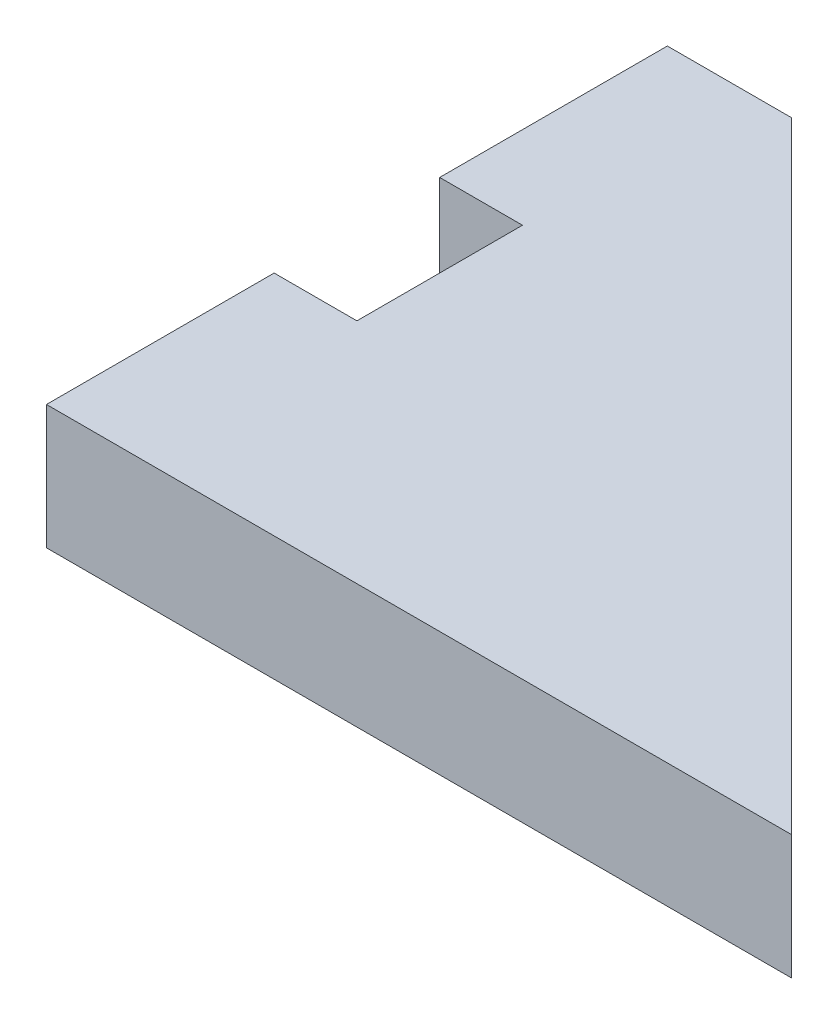
ISO-10303-21;
HEADER;
FILE_DESCRIPTION(('STEP AP214'),'2;1');
FILE_NAME('part.step','',(''),(''),'','','');
FILE_SCHEMA(('AUTOMOTIVE_DESIGN { 1 0 10303 214 1 1 1 1 }'));
ENDSEC;
DATA;
#1=APPLICATION_CONTEXT('core data for automotive mechanical design processes');
#2=APPLICATION_PROTOCOL_DEFINITION('international standard','automotive_design',2000,#1);
#3=PRODUCT_CONTEXT('',#1,'mechanical');
#4=PRODUCT('Part','Part','',(#3));
#5=PRODUCT_RELATED_PRODUCT_CATEGORY('part','',(#4));
#6=PRODUCT_DEFINITION_FORMATION('','',#4);
#7=PRODUCT_DEFINITION_CONTEXT('part definition',#1,'design');
#8=PRODUCT_DEFINITION('design','',#6,#7);
#9=PRODUCT_DEFINITION_SHAPE('','',#8);
#10=(LENGTH_UNIT() NAMED_UNIT(*) SI_UNIT(.MILLI.,.METRE.));
#11=(NAMED_UNIT(*) PLANE_ANGLE_UNIT() SI_UNIT($,.RADIAN.));
#12=(NAMED_UNIT(*) SI_UNIT($,.STERADIAN.) SOLID_ANGLE_UNIT());
#13=UNCERTAINTY_MEASURE_WITH_UNIT(LENGTH_MEASURE(1.E-05),#10,'distance_accuracy_value','');
#14=(GEOMETRIC_REPRESENTATION_CONTEXT(3) GLOBAL_UNCERTAINTY_ASSIGNED_CONTEXT((#13)) GLOBAL_UNIT_ASSIGNED_CONTEXT((#10,
#11,#12)) REPRESENTATION_CONTEXT('',''));
#15=CARTESIAN_POINT('',(0.,0.,0.));
#16=DIRECTION('',(0.,0.,1.));
#17=DIRECTION('',(1.,0.,0.));
#18=AXIS2_PLACEMENT_3D('',#15,#16,#17);
#19=CARTESIAN_POINT('',(-1.8,0.3,0.));
#20=DIRECTION('',(0.,0.,-1.));
#21=DIRECTION('',(-1.,0.,0.));
#22=AXIS2_PLACEMENT_3D('',#19,#20,#21);
#23=PLANE('',#22);
#24=DIRECTION('',(1.,0.,0.));
#25=VECTOR('',#24,1.);
#26=CARTESIAN_POINT('',(-1.8,0.,0.));
#27=LINE('',#26,#25);
#28=CARTESIAN_POINT('',(-1.8,0.,0.));
#29=VERTEX_POINT('',#28);
#30=CARTESIAN_POINT('',(0.,0.,0.));
#31=VERTEX_POINT('',#30);
#32=EDGE_CURVE('E129',#29,#31,#27,.T.);
#33=ORIENTED_EDGE('',*,*,#32,.T.);
#34=DIRECTION('',(0.,-1.,0.));
#35=VECTOR('',#34,1.);
#36=CARTESIAN_POINT('',(0.,0.3,0.));
#37=LINE('',#36,#35);
#38=CARTESIAN_POINT('',(0.,0.3,0.));
#39=VERTEX_POINT('',#38);
#40=EDGE_CURVE('E11',#39,#31,#37,.T.);
#41=ORIENTED_EDGE('',*,*,#40,.F.);
#42=DIRECTION('',(1.,0.,0.));
#43=VECTOR('',#42,1.);
#44=CARTESIAN_POINT('',(-1.8,0.3,0.));
#45=LINE('',#44,#43);
#46=CARTESIAN_POINT('',(-1.8,0.3,0.));
#47=VERTEX_POINT('',#46);
#48=EDGE_CURVE('E143',#47,#39,#45,.T.);
#49=ORIENTED_EDGE('',*,*,#48,.F.);
#50=DIRECTION('',(0.,-1.,0.));
#51=VECTOR('',#50,1.);
#52=CARTESIAN_POINT('',(-1.8,0.3,0.));
#53=LINE('',#52,#51);
#54=EDGE_CURVE('E125',#47,#29,#53,.T.);
#55=ORIENTED_EDGE('',*,*,#54,.T.);
#56=EDGE_LOOP('',(#33,#41,#49,#55));
#57=FACE_BOUND('',#56,.T.);
#58=ADVANCED_FACE('F33',(#57),#23,.F.);
#59=CARTESIAN_POINT('',(0.,0.3,0.));
#60=DIRECTION('',(-0.707106781186544,0.,0.707106781186551));
#61=DIRECTION('',(0.707106781186551,0.,0.707106781186544));
#62=AXIS2_PLACEMENT_3D('',#59,#60,#61);
#63=PLANE('',#62);
#64=DIRECTION('',(-0.707106781186551,0.,-0.707106781186544));
#65=VECTOR('',#64,1.);
#66=CARTESIAN_POINT('',(0.,0.,0.));
#67=LINE('',#66,#65);
#68=CARTESIAN_POINT('',(-1.5,0.,-1.49999999999998));
#69=VERTEX_POINT('',#68);
#70=EDGE_CURVE('E132',#31,#69,#67,.T.);
#71=ORIENTED_EDGE('',*,*,#70,.T.);
#72=DIRECTION('',(0.,-1.,0.));
#73=VECTOR('',#72,1.);
#74=CARTESIAN_POINT('',(-1.5,0.3,-1.49999999999998));
#75=LINE('',#74,#73);
#76=CARTESIAN_POINT('',(-1.5,0.3,-1.49999999999998));
#77=VERTEX_POINT('',#76);
#78=EDGE_CURVE('E41',#77,#69,#75,.T.);
#79=ORIENTED_EDGE('',*,*,#78,.F.);
#80=DIRECTION('',(-0.707106781186551,0.,-0.707106781186544));
#81=VECTOR('',#80,1.);
#82=CARTESIAN_POINT('',(0.,0.3,0.));
#83=LINE('',#82,#81);
#84=EDGE_CURVE('E92',#39,#77,#83,.T.);
#85=ORIENTED_EDGE('',*,*,#84,.F.);
#86=ORIENTED_EDGE('',*,*,#40,.T.);
#87=EDGE_LOOP('',(#71,#79,#85,#86));
#88=FACE_BOUND('',#87,.T.);
#89=ADVANCED_FACE('F178',(#88),#63,.F.);
#90=CARTESIAN_POINT('',(-1.5,0.3,-1.49999999999998));
#91=DIRECTION('',(0.,0.,1.));
#92=DIRECTION('',(1.,0.,0.));
#93=AXIS2_PLACEMENT_3D('',#90,#91,#92);
#94=PLANE('',#93);
#95=DIRECTION('',(-1.,0.,0.));
#96=VECTOR('',#95,1.);
#97=CARTESIAN_POINT('',(-1.5,0.,-1.49999999999998));
#98=LINE('',#97,#96);
#99=CARTESIAN_POINT('',(-1.8,0.,-1.49999999999998));
#100=VERTEX_POINT('',#99);
#101=EDGE_CURVE('E134',#69,#100,#98,.T.);
#102=ORIENTED_EDGE('',*,*,#101,.T.);
#103=DIRECTION('',(0.,-1.,0.));
#104=VECTOR('',#103,1.);
#105=CARTESIAN_POINT('',(-1.8,0.3,-1.49999999999998));
#106=LINE('',#105,#104);
#107=CARTESIAN_POINT('',(-1.8,0.3,-1.49999999999998));
#108=VERTEX_POINT('',#107);
#109=EDGE_CURVE('E150',#108,#100,#106,.T.);
#110=ORIENTED_EDGE('',*,*,#109,.F.);
#111=DIRECTION('',(-1.,0.,0.));
#112=VECTOR('',#111,1.);
#113=CARTESIAN_POINT('',(-1.5,0.3,-1.49999999999998));
#114=LINE('',#113,#112);
#115=EDGE_CURVE('E158',#77,#108,#114,.T.);
#116=ORIENTED_EDGE('',*,*,#115,.F.);
#117=ORIENTED_EDGE('',*,*,#78,.T.);
#118=EDGE_LOOP('',(#102,#110,#116,#117));
#119=FACE_BOUND('',#118,.T.);
#120=ADVANCED_FACE('F156',(#119),#94,.F.);
#121=CARTESIAN_POINT('',(-1.8,0.3,-1.49999999999998));
#122=DIRECTION('',(1.,0.,0.));
#123=DIRECTION('',(0.,0.,-1.));
#124=AXIS2_PLACEMENT_3D('',#121,#122,#123);
#125=PLANE('',#124);
#126=DIRECTION('',(0.,0.,1.));
#127=VECTOR('',#126,1.);
#128=CARTESIAN_POINT('',(-1.8,0.,-1.49999999999998));
#129=LINE('',#128,#127);
#130=CARTESIAN_POINT('',(-1.8,0.,-0.949999999999992));
#131=VERTEX_POINT('',#130);
#132=EDGE_CURVE('E136',#100,#131,#129,.T.);
#133=ORIENTED_EDGE('',*,*,#132,.T.);
#134=DIRECTION('',(0.,-1.,0.));
#135=VECTOR('',#134,1.);
#136=CARTESIAN_POINT('',(-1.8,0.3,-0.949999999999992));
#137=LINE('',#136,#135);
#138=CARTESIAN_POINT('',(-1.8,0.3,-0.949999999999992));
#139=VERTEX_POINT('',#138);
#140=EDGE_CURVE('E147',#139,#131,#137,.T.);
#141=ORIENTED_EDGE('',*,*,#140,.F.);
#142=DIRECTION('',(0.,0.,1.));
#143=VECTOR('',#142,1.);
#144=CARTESIAN_POINT('',(-1.8,0.3,-1.49999999999998));
#145=LINE('',#144,#143);
#146=EDGE_CURVE('E170',#108,#139,#145,.T.);
#147=ORIENTED_EDGE('',*,*,#146,.F.);
#148=ORIENTED_EDGE('',*,*,#109,.T.);
#149=EDGE_LOOP('',(#133,#141,#147,#148));
#150=FACE_BOUND('',#149,.T.);
#151=ADVANCED_FACE('F166',(#150),#125,.F.);
#152=CARTESIAN_POINT('',(-1.8,0.3,-0.949999999999992));
#153=DIRECTION('',(0.,0.,-1.));
#154=DIRECTION('',(-1.,0.,0.));
#155=AXIS2_PLACEMENT_3D('',#152,#153,#154);
#156=PLANE('',#155);
#157=DIRECTION('',(1.,0.,0.));
#158=VECTOR('',#157,1.);
#159=CARTESIAN_POINT('',(-1.8,0.,-0.949999999999992));
#160=LINE('',#159,#158);
#161=CARTESIAN_POINT('',(-1.6,0.,-0.949999999999992));
#162=VERTEX_POINT('',#161);
#163=EDGE_CURVE('E138',#131,#162,#160,.T.);
#164=ORIENTED_EDGE('',*,*,#163,.T.);
#165=DIRECTION('',(0.,-1.,0.));
#166=VECTOR('',#165,1.);
#167=CARTESIAN_POINT('',(-1.6,0.3,-0.949999999999992));
#168=LINE('',#167,#166);
#169=CARTESIAN_POINT('',(-1.6,0.3,-0.949999999999992));
#170=VERTEX_POINT('',#169);
#171=EDGE_CURVE('E120',#170,#162,#168,.T.);
#172=ORIENTED_EDGE('',*,*,#171,.F.);
#173=DIRECTION('',(1.,0.,0.));
#174=VECTOR('',#173,1.);
#175=CARTESIAN_POINT('',(-1.8,0.3,-0.949999999999992));
#176=LINE('',#175,#174);
#177=EDGE_CURVE('E111',#139,#170,#176,.T.);
#178=ORIENTED_EDGE('',*,*,#177,.F.);
#179=ORIENTED_EDGE('',*,*,#140,.T.);
#180=EDGE_LOOP('',(#164,#172,#178,#179));
#181=FACE_BOUND('',#180,.T.);
#182=ADVANCED_FACE('F169',(#181),#156,.F.);
#183=CARTESIAN_POINT('',(-1.6,0.3,-0.949999999999992));
#184=DIRECTION('',(1.,0.,0.));
#185=DIRECTION('',(0.,0.,-1.));
#186=AXIS2_PLACEMENT_3D('',#183,#184,#185);
#187=PLANE('',#186);
#188=DIRECTION('',(0.,0.,1.));
#189=VECTOR('',#188,1.);
#190=CARTESIAN_POINT('',(-1.6,0.,-0.949999999999992));
#191=LINE('',#190,#189);
#192=CARTESIAN_POINT('',(-1.6,0.,-0.549999999999992));
#193=VERTEX_POINT('',#192);
#194=EDGE_CURVE('E119',#162,#193,#191,.T.);
#195=ORIENTED_EDGE('',*,*,#194,.T.);
#196=DIRECTION('',(0.,-1.,0.));
#197=VECTOR('',#196,1.);
#198=CARTESIAN_POINT('',(-1.6,0.3,-0.549999999999992));
#199=LINE('',#198,#197);
#200=CARTESIAN_POINT('',(-1.6,0.3,-0.549999999999992));
#201=VERTEX_POINT('',#200);
#202=EDGE_CURVE('E116',#201,#193,#199,.T.);
#203=ORIENTED_EDGE('',*,*,#202,.F.);
#204=DIRECTION('',(0.,0.,1.));
#205=VECTOR('',#204,1.);
#206=CARTESIAN_POINT('',(-1.6,0.3,-0.949999999999992));
#207=LINE('',#206,#205);
#208=EDGE_CURVE('E105',#170,#201,#207,.T.);
#209=ORIENTED_EDGE('',*,*,#208,.F.);
#210=ORIENTED_EDGE('',*,*,#171,.T.);
#211=EDGE_LOOP('',(#195,#203,#209,#210));
#212=FACE_BOUND('',#211,.T.);
#213=ADVANCED_FACE('F117',(#212),#187,.F.);
#214=CARTESIAN_POINT('',(-1.6,0.3,-0.549999999999992));
#215=DIRECTION('',(0.,0.,1.));
#216=DIRECTION('',(1.,0.,0.));
#217=AXIS2_PLACEMENT_3D('',#214,#215,#216);
#218=PLANE('',#217);
#219=DIRECTION('',(-1.,0.,0.));
#220=VECTOR('',#219,1.);
#221=CARTESIAN_POINT('',(-1.6,0.,-0.549999999999992));
#222=LINE('',#221,#220);
#223=CARTESIAN_POINT('',(-1.8,0.,-0.549999999999992));
#224=VERTEX_POINT('',#223);
#225=EDGE_CURVE('E78',#193,#224,#222,.T.);
#226=ORIENTED_EDGE('',*,*,#225,.T.);
#227=DIRECTION('',(0.,-1.,0.));
#228=VECTOR('',#227,1.);
#229=CARTESIAN_POINT('',(-1.8,0.3,-0.549999999999992));
#230=LINE('',#229,#228);
#231=CARTESIAN_POINT('',(-1.8,0.3,-0.549999999999992));
#232=VERTEX_POINT('',#231);
#233=EDGE_CURVE('E121',#232,#224,#230,.T.);
#234=ORIENTED_EDGE('',*,*,#233,.F.);
#235=DIRECTION('',(-1.,0.,0.));
#236=VECTOR('',#235,1.);
#237=CARTESIAN_POINT('',(-1.6,0.3,-0.549999999999992));
#238=LINE('',#237,#236);
#239=EDGE_CURVE('E109',#201,#232,#238,.T.);
#240=ORIENTED_EDGE('',*,*,#239,.F.);
#241=ORIENTED_EDGE('',*,*,#202,.T.);
#242=EDGE_LOOP('',(#226,#234,#240,#241));
#243=FACE_BOUND('',#242,.T.);
#244=ADVANCED_FACE('F123',(#243),#218,.F.);
#245=CARTESIAN_POINT('',(-1.8,0.3,-0.549999999999992));
#246=DIRECTION('',(1.,0.,0.));
#247=DIRECTION('',(0.,0.,-1.));
#248=AXIS2_PLACEMENT_3D('',#245,#246,#247);
#249=PLANE('',#248);
#250=DIRECTION('',(0.,0.,1.));
#251=VECTOR('',#250,1.);
#252=CARTESIAN_POINT('',(-1.8,0.,-0.549999999999992));
#253=LINE('',#252,#251);
#254=EDGE_CURVE('E84',#224,#29,#253,.T.);
#255=ORIENTED_EDGE('',*,*,#254,.T.);
#256=ORIENTED_EDGE('',*,*,#54,.F.);
#257=DIRECTION('',(0.,0.,1.));
#258=VECTOR('',#257,1.);
#259=CARTESIAN_POINT('',(-1.8,0.3,-0.549999999999992));
#260=LINE('',#259,#258);
#261=EDGE_CURVE('E49',#232,#47,#260,.T.);
#262=ORIENTED_EDGE('',*,*,#261,.F.);
#263=ORIENTED_EDGE('',*,*,#233,.T.);
#264=EDGE_LOOP('',(#255,#256,#262,#263));
#265=FACE_BOUND('',#264,.T.);
#266=ADVANCED_FACE('F194',(#265),#249,.F.);
#267=CARTESIAN_POINT('',(0.,0.3,0.));
#268=DIRECTION('',(0.,-1.,0.));
#269=DIRECTION('',(0.,0.,-1.));
#270=AXIS2_PLACEMENT_3D('',#267,#268,#269);
#271=PLANE('',#270);
#272=ORIENTED_EDGE('',*,*,#48,.T.);
#273=ORIENTED_EDGE('',*,*,#84,.T.);
#274=ORIENTED_EDGE('',*,*,#115,.T.);
#275=ORIENTED_EDGE('',*,*,#146,.T.);
#276=ORIENTED_EDGE('',*,*,#177,.T.);
#277=ORIENTED_EDGE('',*,*,#208,.T.);
#278=ORIENTED_EDGE('',*,*,#239,.T.);
#279=ORIENTED_EDGE('',*,*,#261,.T.);
#280=EDGE_LOOP('',(#272,#273,#274,#275,#276,#277,#278,#279));
#281=FACE_BOUND('',#280,.T.);
#282=ADVANCED_FACE('F107',(#281),#271,.F.);
#283=CARTESIAN_POINT('',(0.,0.,0.));
#284=DIRECTION('',(0.,-1.,0.));
#285=DIRECTION('',(0.,0.,-1.));
#286=AXIS2_PLACEMENT_3D('',#283,#284,#285);
#287=PLANE('',#286);
#288=ORIENTED_EDGE('',*,*,#32,.F.);
#289=ORIENTED_EDGE('',*,*,#254,.F.);
#290=ORIENTED_EDGE('',*,*,#225,.F.);
#291=ORIENTED_EDGE('',*,*,#194,.F.);
#292=ORIENTED_EDGE('',*,*,#163,.F.);
#293=ORIENTED_EDGE('',*,*,#132,.F.);
#294=ORIENTED_EDGE('',*,*,#101,.F.);
#295=ORIENTED_EDGE('',*,*,#70,.F.);
#296=EDGE_LOOP('',(#288,#289,#290,#291,#292,#293,#294,#295));
#297=FACE_BOUND('',#296,.T.);
#298=ADVANCED_FACE('F162',(#297),#287,.T.);
#299=CLOSED_SHELL('',(#58,#89,#120,#151,#182,#213,#244,#266,#282,#298));
#300=MANIFOLD_SOLID_BREP('B2',#299);
#301=ADVANCED_BREP_SHAPE_REPRESENTATION('',(#18,#300),#14);
#302=SHAPE_DEFINITION_REPRESENTATION(#9,#301);
ENDSEC;
END-ISO-10303-21;
